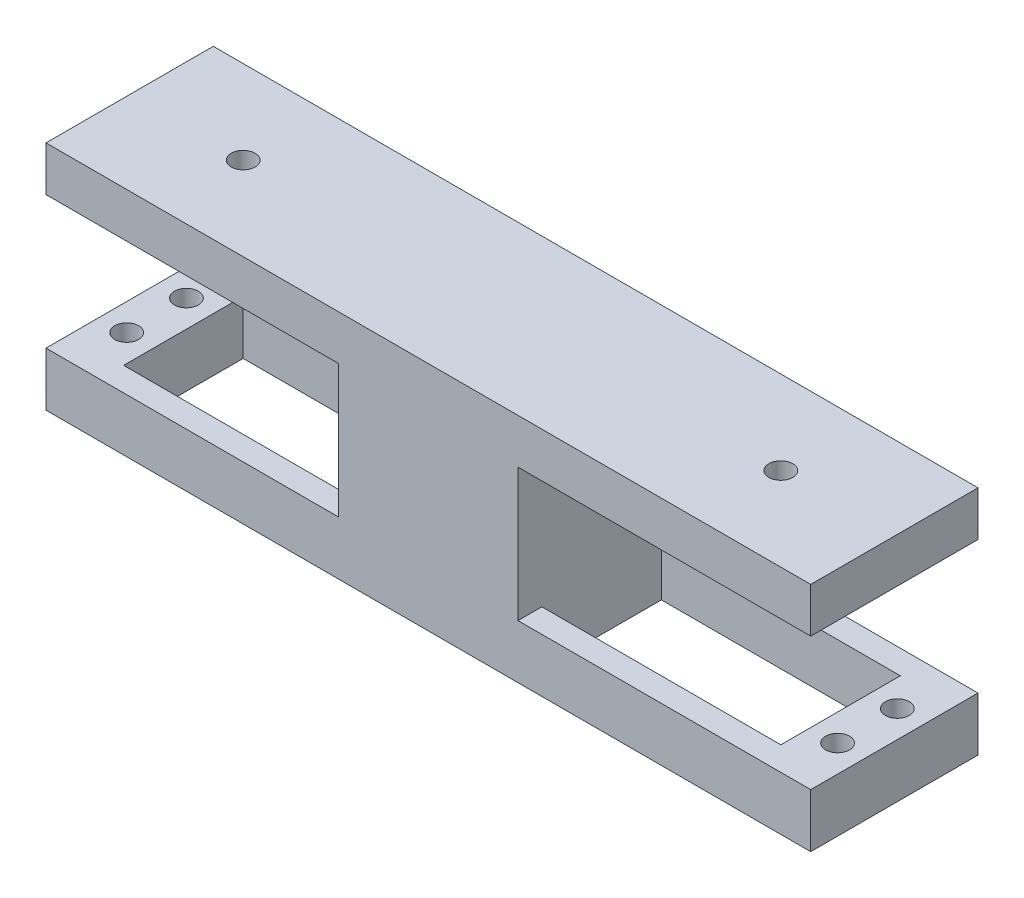
ISO-10303-21;
HEADER;
FILE_DESCRIPTION(('STEP AP214'),'2;1');
FILE_NAME('part.step','',(''),(''),'','','');
FILE_SCHEMA(('AUTOMOTIVE_DESIGN { 1 0 10303 214 1 1 1 1 }'));
ENDSEC;
DATA;
#1=APPLICATION_CONTEXT('core data for automotive mechanical design processes');
#2=APPLICATION_PROTOCOL_DEFINITION('international standard','automotive_design',2000,#1);
#3=PRODUCT_CONTEXT('',#1,'mechanical');
#4=PRODUCT('Part','Part','',(#3));
#5=PRODUCT_RELATED_PRODUCT_CATEGORY('part','',(#4));
#6=PRODUCT_DEFINITION_FORMATION('','',#4);
#7=PRODUCT_DEFINITION_CONTEXT('part definition',#1,'design');
#8=PRODUCT_DEFINITION('design','',#6,#7);
#9=PRODUCT_DEFINITION_SHAPE('','',#8);
#10=(LENGTH_UNIT() NAMED_UNIT(*) SI_UNIT(.MILLI.,.METRE.));
#11=(NAMED_UNIT(*) PLANE_ANGLE_UNIT() SI_UNIT($,.RADIAN.));
#12=(NAMED_UNIT(*) SI_UNIT($,.STERADIAN.) SOLID_ANGLE_UNIT());
#13=UNCERTAINTY_MEASURE_WITH_UNIT(LENGTH_MEASURE(1.E-05),#10,'distance_accuracy_value','');
#14=(GEOMETRIC_REPRESENTATION_CONTEXT(3) GLOBAL_UNCERTAINTY_ASSIGNED_CONTEXT((#13)) GLOBAL_UNIT_ASSIGNED_CONTEXT((#10,
#11,#12)) REPRESENTATION_CONTEXT('',''));
#15=CARTESIAN_POINT('',(0.,0.,0.));
#16=DIRECTION('',(0.,0.,1.));
#17=DIRECTION('',(1.,0.,0.));
#18=AXIS2_PLACEMENT_3D('',#15,#16,#17);
#19=CARTESIAN_POINT('',(0.,0.,28.));
#20=DIRECTION('',(0.,1.,0.));
#21=DIRECTION('',(0.,0.,1.));
#22=AXIS2_PLACEMENT_3D('',#19,#20,#21);
#23=PLANE('',#22);
#24=CARTESIAN_POINT('',(139.5,0.,19.));
#25=DIRECTION('',(0.,-1.,0.));
#26=DIRECTION('',(0.,0.,-1.));
#27=AXIS2_PLACEMENT_3D('',#24,#25,#26);
#28=CIRCLE('',#27,2.00000000000328);
#29=CARTESIAN_POINT('',(139.5,0.,16.9999999999967));
#30=VERTEX_POINT('',#29);
#31=EDGE_CURVE('E276',#30,#30,#28,.T.);
#32=ORIENTED_EDGE('',*,*,#31,.F.);
#33=EDGE_LOOP('',(#32));
#34=FACE_BOUND('',#33,.T.);
#35=CARTESIAN_POINT('',(90.5,0.,9.));
#36=DIRECTION('',(0.,-1.,0.));
#37=DIRECTION('',(0.,0.,-1.));
#38=AXIS2_PLACEMENT_3D('',#35,#36,#37);
#39=CIRCLE('',#38,2.);
#40=CARTESIAN_POINT('',(90.5,0.,7.));
#41=VERTEX_POINT('',#40);
#42=EDGE_CURVE('E284',#41,#41,#39,.T.);
#43=ORIENTED_EDGE('',*,*,#42,.F.);
#44=EDGE_LOOP('',(#43));
#45=FACE_BOUND('',#44,.T.);
#46=CARTESIAN_POINT('',(90.5,0.,19.));
#47=DIRECTION('',(0.,-1.,0.));
#48=DIRECTION('',(0.,0.,-1.));
#49=AXIS2_PLACEMENT_3D('',#46,#47,#48);
#50=CIRCLE('',#49,2.0000000000021);
#51=CARTESIAN_POINT('',(90.5,0.,16.9999999999979));
#52=VERTEX_POINT('',#51);
#53=EDGE_CURVE('E301',#52,#52,#50,.T.);
#54=ORIENTED_EDGE('',*,*,#53,.F.);
#55=EDGE_LOOP('',(#54));
#56=FACE_BOUND('',#55,.T.);
#57=CARTESIAN_POINT('',(20.5,0.,19.));
#58=DIRECTION('',(0.,-1.,0.));
#59=DIRECTION('',(0.,0.,-1.));
#60=AXIS2_PLACEMENT_3D('',#57,#58,#59);
#61=CIRCLE('',#60,2.00000000000001);
#62=CARTESIAN_POINT('',(20.5,0.,17.));
#63=VERTEX_POINT('',#62);
#64=EDGE_CURVE('E296',#63,#63,#61,.T.);
#65=ORIENTED_EDGE('',*,*,#64,.F.);
#66=EDGE_LOOP('',(#65));
#67=FACE_BOUND('',#66,.T.);
#68=CARTESIAN_POINT('',(69.5,0.,9.));
#69=DIRECTION('',(0.,-1.,0.));
#70=DIRECTION('',(0.,0.,-1.));
#71=AXIS2_PLACEMENT_3D('',#68,#69,#70);
#72=CIRCLE('',#71,2.0000000000021);
#73=CARTESIAN_POINT('',(69.5,0.,6.9999999999979));
#74=VERTEX_POINT('',#73);
#75=EDGE_CURVE('E264',#74,#74,#72,.T.);
#76=ORIENTED_EDGE('',*,*,#75,.F.);
#77=EDGE_LOOP('',(#76));
#78=FACE_BOUND('',#77,.T.);
#79=CARTESIAN_POINT('',(69.5,0.,19.));
#80=DIRECTION('',(0.,-1.,0.));
#81=DIRECTION('',(0.,0.,-1.));
#82=AXIS2_PLACEMENT_3D('',#79,#80,#81);
#83=CIRCLE('',#82,2.);
#84=CARTESIAN_POINT('',(69.5,0.,17.));
#85=VERTEX_POINT('',#84);
#86=EDGE_CURVE('E277',#85,#85,#83,.T.);
#87=ORIENTED_EDGE('',*,*,#86,.F.);
#88=EDGE_LOOP('',(#87));
#89=FACE_BOUND('',#88,.T.);
#90=CARTESIAN_POINT('',(139.5,0.,8.99999999999999));
#91=DIRECTION('',(0.,-1.,0.));
#92=DIRECTION('',(0.,0.,-1.));
#93=AXIS2_PLACEMENT_3D('',#90,#91,#92);
#94=CIRCLE('',#93,2.);
#95=CARTESIAN_POINT('',(139.5,0.,6.99999999999999));
#96=VERTEX_POINT('',#95);
#97=EDGE_CURVE('E272',#96,#96,#94,.T.);
#98=ORIENTED_EDGE('',*,*,#97,.F.);
#99=EDGE_LOOP('',(#98));
#100=FACE_BOUND('',#99,.T.);
#101=CARTESIAN_POINT('',(20.5,0.,9.));
#102=DIRECTION('',(0.,-1.,0.));
#103=DIRECTION('',(0.,0.,-1.));
#104=AXIS2_PLACEMENT_3D('',#101,#102,#103);
#105=CIRCLE('',#104,2.0000000000033);
#106=CARTESIAN_POINT('',(20.5,0.,6.9999999999967));
#107=VERTEX_POINT('',#106);
#108=EDGE_CURVE('E300',#107,#107,#105,.T.);
#109=ORIENTED_EDGE('',*,*,#108,.F.);
#110=EDGE_LOOP('',(#109));
#111=FACE_BOUND('',#110,.T.);
#112=DIRECTION('',(0.,0.,1.));
#113=VECTOR('',#112,1.);
#114=CARTESIAN_POINT('',(65.,0.,14.));
#115=LINE('',#114,#113);
#116=CARTESIAN_POINT('',(65.,0.,4.));
#117=VERTEX_POINT('',#116);
#118=CARTESIAN_POINT('',(65.,0.,24.));
#119=VERTEX_POINT('',#118);
#120=EDGE_CURVE('E312',#117,#119,#115,.T.);
#121=ORIENTED_EDGE('',*,*,#120,.F.);
#122=DIRECTION('',(1.,0.,0.));
#123=VECTOR('',#122,1.);
#124=CARTESIAN_POINT('',(25.,0.,4.));
#125=LINE('',#124,#123);
#126=CARTESIAN_POINT('',(25.,0.,4.));
#127=VERTEX_POINT('',#126);
#128=EDGE_CURVE('E325',#127,#117,#125,.T.);
#129=ORIENTED_EDGE('',*,*,#128,.F.);
#130=DIRECTION('',(0.,0.,-1.));
#131=VECTOR('',#130,1.);
#132=CARTESIAN_POINT('',(25.,0.,24.));
#133=LINE('',#132,#131);
#134=CARTESIAN_POINT('',(25.,0.,24.));
#135=VERTEX_POINT('',#134);
#136=EDGE_CURVE('E321',#135,#127,#133,.T.);
#137=ORIENTED_EDGE('',*,*,#136,.F.);
#138=DIRECTION('',(-1.,0.,0.));
#139=VECTOR('',#138,1.);
#140=CARTESIAN_POINT('',(65.,0.,24.));
#141=LINE('',#140,#139);
#142=EDGE_CURVE('E316',#119,#135,#141,.T.);
#143=ORIENTED_EDGE('',*,*,#142,.F.);
#144=EDGE_LOOP('',(#121,#129,#137,#143));
#145=FACE_BOUND('',#144,.T.);
#146=DIRECTION('',(0.,0.,1.));
#147=VECTOR('',#146,1.);
#148=CARTESIAN_POINT('',(135.,0.,24.));
#149=LINE('',#148,#147);
#150=CARTESIAN_POINT('',(135.,0.,4.));
#151=VERTEX_POINT('',#150);
#152=CARTESIAN_POINT('',(135.,0.,24.));
#153=VERTEX_POINT('',#152);
#154=EDGE_CURVE('E364',#151,#153,#149,.T.);
#155=ORIENTED_EDGE('',*,*,#154,.F.);
#156=DIRECTION('',(1.,0.,0.));
#157=VECTOR('',#156,1.);
#158=CARTESIAN_POINT('',(135.,0.,4.));
#159=LINE('',#158,#157);
#160=CARTESIAN_POINT('',(95.,0.,4.));
#161=VERTEX_POINT('',#160);
#162=EDGE_CURVE('E317',#161,#151,#159,.T.);
#163=ORIENTED_EDGE('',*,*,#162,.F.);
#164=DIRECTION('',(0.,0.,-1.));
#165=VECTOR('',#164,1.);
#166=CARTESIAN_POINT('',(95.,0.,4.));
#167=LINE('',#166,#165);
#168=CARTESIAN_POINT('',(95.,0.,24.));
#169=VERTEX_POINT('',#168);
#170=EDGE_CURVE('E346',#169,#161,#167,.T.);
#171=ORIENTED_EDGE('',*,*,#170,.F.);
#172=DIRECTION('',(-1.,0.,0.));
#173=VECTOR('',#172,1.);
#174=CARTESIAN_POINT('',(95.,0.,24.));
#175=LINE('',#174,#173);
#176=EDGE_CURVE('E360',#153,#169,#175,.T.);
#177=ORIENTED_EDGE('',*,*,#176,.F.);
#178=EDGE_LOOP('',(#155,#163,#171,#177));
#179=FACE_BOUND('',#178,.T.);
#180=DIRECTION('',(1.,0.,0.));
#181=VECTOR('',#180,1.);
#182=CARTESIAN_POINT('',(0.,0.,0.));
#183=LINE('',#182,#181);
#184=CARTESIAN_POINT('',(16.,0.,0.));
#185=VERTEX_POINT('',#184);
#186=CARTESIAN_POINT('',(144.,0.,0.));
#187=VERTEX_POINT('',#186);
#188=EDGE_CURVE('E396',#185,#187,#183,.T.);
#189=ORIENTED_EDGE('',*,*,#188,.T.);
#190=DIRECTION('',(0.,0.,1.));
#191=VECTOR('',#190,1.);
#192=CARTESIAN_POINT('',(144.,0.,28.));
#193=LINE('',#192,#191);
#194=CARTESIAN_POINT('',(144.,0.,28.));
#195=VERTEX_POINT('',#194);
#196=EDGE_CURVE('E259',#187,#195,#193,.T.);
#197=ORIENTED_EDGE('',*,*,#196,.T.);
#198=DIRECTION('',(1.,0.,0.));
#199=VECTOR('',#198,1.);
#200=CARTESIAN_POINT('',(0.,0.,28.));
#201=LINE('',#200,#199);
#202=CARTESIAN_POINT('',(16.,0.,28.));
#203=VERTEX_POINT('',#202);
#204=EDGE_CURVE('E413',#203,#195,#201,.T.);
#205=ORIENTED_EDGE('',*,*,#204,.F.);
#206=DIRECTION('',(0.,0.,-1.));
#207=VECTOR('',#206,1.);
#208=CARTESIAN_POINT('',(16.,0.,28.));
#209=LINE('',#208,#207);
#210=EDGE_CURVE('E244',#203,#185,#209,.T.);
#211=ORIENTED_EDGE('',*,*,#210,.T.);
#212=EDGE_LOOP('',(#189,#197,#205,#211));
#213=FACE_BOUND('',#212,.T.);
#214=ADVANCED_FACE('F45',(#34,#45,#56,#67,#78,#89,#100,#111,#145,#179,#213),#23,.F.);
#215=CARTESIAN_POINT('',(0.,0.,28.));
#216=DIRECTION('',(0.,0.,1.));
#217=DIRECTION('',(1.,0.,0.));
#218=AXIS2_PLACEMENT_3D('',#215,#216,#217);
#219=PLANE('',#218);
#220=DIRECTION('',(0.,-1.,0.));
#221=VECTOR('',#220,1.);
#222=CARTESIAN_POINT('',(95.,34.,28.));
#223=LINE('',#222,#221);
#224=CARTESIAN_POINT('',(95.,31.25,28.));
#225=VERTEX_POINT('',#224);
#226=CARTESIAN_POINT('',(95.,9.00000000000001,28.));
#227=VERTEX_POINT('',#226);
#228=EDGE_CURVE('E401',#225,#227,#223,.T.);
#229=ORIENTED_EDGE('',*,*,#228,.F.);
#230=DIRECTION('',(1.,0.,0.));
#231=VECTOR('',#230,1.);
#232=CARTESIAN_POINT('',(144.,31.25,28.));
#233=LINE('',#232,#231);
#234=CARTESIAN_POINT('',(144.,31.25,28.));
#235=VERTEX_POINT('',#234);
#236=EDGE_CURVE('E232',#225,#235,#233,.T.);
#237=ORIENTED_EDGE('',*,*,#236,.T.);
#238=DIRECTION('',(0.,-1.,0.));
#239=VECTOR('',#238,1.);
#240=CARTESIAN_POINT('',(144.,45.,28.));
#241=LINE('',#240,#239);
#242=CARTESIAN_POINT('',(144.,38.75,28.));
#243=VERTEX_POINT('',#242);
#244=EDGE_CURVE('E246',#243,#235,#241,.T.);
#245=ORIENTED_EDGE('',*,*,#244,.F.);
#246=DIRECTION('',(1.,0.,0.));
#247=VECTOR('',#246,1.);
#248=CARTESIAN_POINT('',(16.,38.75,28.));
#249=LINE('',#248,#247);
#250=CARTESIAN_POINT('',(16.,38.75,28.));
#251=VERTEX_POINT('',#250);
#252=EDGE_CURVE('E204',#251,#243,#249,.T.);
#253=ORIENTED_EDGE('',*,*,#252,.F.);
#254=DIRECTION('',(0.,-1.,0.));
#255=VECTOR('',#254,1.);
#256=CARTESIAN_POINT('',(16.,45.,28.));
#257=LINE('',#256,#255);
#258=CARTESIAN_POINT('',(16.,31.25,28.));
#259=VERTEX_POINT('',#258);
#260=EDGE_CURVE('E199',#251,#259,#257,.T.);
#261=ORIENTED_EDGE('',*,*,#260,.T.);
#262=CARTESIAN_POINT('',(65.,31.25,28.));
#263=VERTEX_POINT('',#262);
#264=EDGE_CURVE('E228',#259,#263,#233,.T.);
#265=ORIENTED_EDGE('',*,*,#264,.T.);
#266=DIRECTION('',(0.,1.,0.));
#267=VECTOR('',#266,1.);
#268=CARTESIAN_POINT('',(65.,34.,28.));
#269=LINE('',#268,#267);
#270=CARTESIAN_POINT('',(65.,9.00000000000001,28.));
#271=VERTEX_POINT('',#270);
#272=EDGE_CURVE('E382',#271,#263,#269,.T.);
#273=ORIENTED_EDGE('',*,*,#272,.F.);
#274=DIRECTION('',(1.,0.,0.));
#275=VECTOR('',#274,1.);
#276=CARTESIAN_POINT('',(65.,9.00000000000001,28.));
#277=LINE('',#276,#275);
#278=CARTESIAN_POINT('',(16.,9.,28.));
#279=VERTEX_POINT('',#278);
#280=EDGE_CURVE('E386',#279,#271,#277,.T.);
#281=ORIENTED_EDGE('',*,*,#280,.F.);
#282=EDGE_CURVE('E193',#279,#203,#257,.T.);
#283=ORIENTED_EDGE('',*,*,#282,.T.);
#284=ORIENTED_EDGE('',*,*,#204,.T.);
#285=CARTESIAN_POINT('',(144.,9.00000000000001,28.));
#286=VERTEX_POINT('',#285);
#287=EDGE_CURVE('E249',#286,#195,#241,.T.);
#288=ORIENTED_EDGE('',*,*,#287,.F.);
#289=DIRECTION('',(1.,0.,0.));
#290=VECTOR('',#289,1.);
#291=CARTESIAN_POINT('',(95.,9.00000000000001,28.));
#292=LINE('',#291,#290);
#293=EDGE_CURVE('E389',#227,#286,#292,.T.);
#294=ORIENTED_EDGE('',*,*,#293,.F.);
#295=EDGE_LOOP('',(#229,#237,#245,#253,#261,#265,#273,#281,#283,#284,#288,#294));
#296=FACE_BOUND('',#295,.T.);
#297=ADVANCED_FACE('F464',(#296),#219,.T.);
#298=CARTESIAN_POINT('',(0.,0.,0.));
#299=DIRECTION('',(0.,0.,1.));
#300=DIRECTION('',(1.,0.,0.));
#301=AXIS2_PLACEMENT_3D('',#298,#299,#300);
#302=PLANE('',#301);
#303=DIRECTION('',(0.,1.,0.));
#304=VECTOR('',#303,1.);
#305=CARTESIAN_POINT('',(65.,34.,0.));
#306=LINE('',#305,#304);
#307=CARTESIAN_POINT('',(65.,9.00000000000001,0.));
#308=VERTEX_POINT('',#307);
#309=CARTESIAN_POINT('',(65.,31.25,0.));
#310=VERTEX_POINT('',#309);
#311=EDGE_CURVE('E381',#308,#310,#306,.T.);
#312=ORIENTED_EDGE('',*,*,#311,.T.);
#313=DIRECTION('',(1.,0.,0.));
#314=VECTOR('',#313,1.);
#315=CARTESIAN_POINT('',(144.,31.25,0.));
#316=LINE('',#315,#314);
#317=CARTESIAN_POINT('',(16.,31.25,0.));
#318=VERTEX_POINT('',#317);
#319=EDGE_CURVE('E188',#318,#310,#316,.T.);
#320=ORIENTED_EDGE('',*,*,#319,.F.);
#321=DIRECTION('',(0.,-1.,0.));
#322=VECTOR('',#321,1.);
#323=CARTESIAN_POINT('',(16.,45.,0.));
#324=LINE('',#323,#322);
#325=CARTESIAN_POINT('',(16.,38.75,0.));
#326=VERTEX_POINT('',#325);
#327=EDGE_CURVE('E181',#326,#318,#324,.T.);
#328=ORIENTED_EDGE('',*,*,#327,.F.);
#329=DIRECTION('',(-1.,0.,0.));
#330=VECTOR('',#329,1.);
#331=CARTESIAN_POINT('',(144.,38.75,0.));
#332=LINE('',#331,#330);
#333=CARTESIAN_POINT('',(144.,38.75,0.));
#334=VERTEX_POINT('',#333);
#335=EDGE_CURVE('E186',#334,#326,#332,.T.);
#336=ORIENTED_EDGE('',*,*,#335,.F.);
#337=DIRECTION('',(0.,-1.,0.));
#338=VECTOR('',#337,1.);
#339=CARTESIAN_POINT('',(144.,45.,0.));
#340=LINE('',#339,#338);
#341=CARTESIAN_POINT('',(144.,31.25,0.));
#342=VERTEX_POINT('',#341);
#343=EDGE_CURVE('E241',#334,#342,#340,.T.);
#344=ORIENTED_EDGE('',*,*,#343,.T.);
#345=CARTESIAN_POINT('',(95.,31.25,0.));
#346=VERTEX_POINT('',#345);
#347=EDGE_CURVE('E227',#346,#342,#316,.T.);
#348=ORIENTED_EDGE('',*,*,#347,.F.);
#349=DIRECTION('',(0.,-1.,0.));
#350=VECTOR('',#349,1.);
#351=CARTESIAN_POINT('',(95.,34.,0.));
#352=LINE('',#351,#350);
#353=CARTESIAN_POINT('',(95.,9.00000000000001,0.));
#354=VERTEX_POINT('',#353);
#355=EDGE_CURVE('E67',#346,#354,#352,.T.);
#356=ORIENTED_EDGE('',*,*,#355,.T.);
#357=DIRECTION('',(1.,0.,0.));
#358=VECTOR('',#357,1.);
#359=CARTESIAN_POINT('',(95.,9.00000000000001,0.));
#360=LINE('',#359,#358);
#361=CARTESIAN_POINT('',(144.,9.,0.));
#362=VERTEX_POINT('',#361);
#363=EDGE_CURVE('E404',#354,#362,#360,.T.);
#364=ORIENTED_EDGE('',*,*,#363,.T.);
#365=EDGE_CURVE('E245',#362,#187,#340,.T.);
#366=ORIENTED_EDGE('',*,*,#365,.T.);
#367=ORIENTED_EDGE('',*,*,#188,.F.);
#368=CARTESIAN_POINT('',(16.,9.00000000000001,0.));
#369=VERTEX_POINT('',#368);
#370=EDGE_CURVE('E194',#369,#185,#324,.T.);
#371=ORIENTED_EDGE('',*,*,#370,.F.);
#372=DIRECTION('',(1.,0.,0.));
#373=VECTOR('',#372,1.);
#374=CARTESIAN_POINT('',(65.,9.00000000000001,0.));
#375=LINE('',#374,#373);
#376=EDGE_CURVE('E378',#369,#308,#375,.T.);
#377=ORIENTED_EDGE('',*,*,#376,.T.);
#378=EDGE_LOOP('',(#312,#320,#328,#336,#344,#348,#356,#364,#366,#367,#371,#377));
#379=FACE_BOUND('',#378,.T.);
#380=ADVANCED_FACE('F184',(#379),#302,.F.);
#381=CARTESIAN_POINT('',(95.,9.00000000000001,0.));
#382=DIRECTION('',(0.,-1.,0.));
#383=DIRECTION('',(1.,0.,0.));
#384=AXIS2_PLACEMENT_3D('',#381,#382,#383);
#385=PLANE('',#384);
#386=CARTESIAN_POINT('',(139.5,9.,19.));
#387=DIRECTION('',(0.,-1.,0.));
#388=DIRECTION('',(1.,0.,0.));
#389=AXIS2_PLACEMENT_3D('',#386,#387,#388);
#390=CIRCLE('',#389,2.00000000000328);
#391=CARTESIAN_POINT('',(141.500000000003,9.,19.));
#392=VERTEX_POINT('',#391);
#393=EDGE_CURVE('E356',#392,#392,#390,.T.);
#394=ORIENTED_EDGE('',*,*,#393,.T.);
#395=EDGE_LOOP('',(#394));
#396=FACE_BOUND('',#395,.T.);
#397=CARTESIAN_POINT('',(139.5,9.,8.99999999999999));
#398=DIRECTION('',(0.,-1.,0.));
#399=DIRECTION('',(1.,0.,0.));
#400=AXIS2_PLACEMENT_3D('',#397,#398,#399);
#401=CIRCLE('',#400,2.);
#402=CARTESIAN_POINT('',(141.5,9.,8.99999999999999));
#403=VERTEX_POINT('',#402);
#404=EDGE_CURVE('E443',#403,#403,#401,.T.);
#405=ORIENTED_EDGE('',*,*,#404,.T.);
#406=EDGE_LOOP('',(#405));
#407=FACE_BOUND('',#406,.T.);
#408=ORIENTED_EDGE('',*,*,#293,.T.);
#409=DIRECTION('',(0.,0.,-1.));
#410=VECTOR('',#409,1.);
#411=CARTESIAN_POINT('',(144.,9.,0.));
#412=LINE('',#411,#410);
#413=EDGE_CURVE('E255',#286,#362,#412,.T.);
#414=ORIENTED_EDGE('',*,*,#413,.T.);
#415=ORIENTED_EDGE('',*,*,#363,.F.);
#416=DIRECTION('',(0.,0.,1.));
#417=VECTOR('',#416,1.);
#418=CARTESIAN_POINT('',(95.,9.00000000000001,0.));
#419=LINE('',#418,#417);
#420=CARTESIAN_POINT('',(95.,9.00000000000001,4.));
#421=VERTEX_POINT('',#420);
#422=EDGE_CURVE('E397',#354,#421,#419,.T.);
#423=ORIENTED_EDGE('',*,*,#422,.T.);
#424=DIRECTION('',(1.,0.,0.));
#425=VECTOR('',#424,1.);
#426=CARTESIAN_POINT('',(95.,9.00000000000001,4.));
#427=LINE('',#426,#425);
#428=CARTESIAN_POINT('',(135.,9.,4.));
#429=VERTEX_POINT('',#428);
#430=EDGE_CURVE('E373',#421,#429,#427,.T.);
#431=ORIENTED_EDGE('',*,*,#430,.T.);
#432=DIRECTION('',(0.,0.,1.));
#433=VECTOR('',#432,1.);
#434=CARTESIAN_POINT('',(135.,9.,0.));
#435=LINE('',#434,#433);
#436=CARTESIAN_POINT('',(135.,9.,24.));
#437=VERTEX_POINT('',#436);
#438=EDGE_CURVE('E432',#429,#437,#435,.T.);
#439=ORIENTED_EDGE('',*,*,#438,.T.);
#440=DIRECTION('',(-1.,0.,0.));
#441=VECTOR('',#440,1.);
#442=CARTESIAN_POINT('',(95.,9.00000000000001,24.));
#443=LINE('',#442,#441);
#444=CARTESIAN_POINT('',(95.,9.00000000000001,24.));
#445=VERTEX_POINT('',#444);
#446=EDGE_CURVE('E333',#437,#445,#443,.T.);
#447=ORIENTED_EDGE('',*,*,#446,.T.);
#448=EDGE_CURVE('E377',#445,#227,#419,.T.);
#449=ORIENTED_EDGE('',*,*,#448,.T.);
#450=EDGE_LOOP('',(#408,#414,#415,#423,#431,#439,#447,#449));
#451=FACE_BOUND('',#450,.T.);
#452=ADVANCED_FACE('F661',(#396,#407,#451),#385,.F.);
#453=CARTESIAN_POINT('',(95.,34.,0.));
#454=DIRECTION('',(-1.,0.,0.));
#455=DIRECTION('',(0.,0.,1.));
#456=AXIS2_PLACEMENT_3D('',#453,#454,#455);
#457=PLANE('',#456);
#458=ORIENTED_EDGE('',*,*,#355,.F.);
#459=DIRECTION('',(0.,0.,1.));
#460=VECTOR('',#459,1.);
#461=CARTESIAN_POINT('',(95.,31.25,0.));
#462=LINE('',#461,#460);
#463=EDGE_CURVE('E62',#346,#225,#462,.T.);
#464=ORIENTED_EDGE('',*,*,#463,.T.);
#465=ORIENTED_EDGE('',*,*,#228,.T.);
#466=ORIENTED_EDGE('',*,*,#448,.F.);
#467=DIRECTION('',(0.,-1.,0.));
#468=VECTOR('',#467,1.);
#469=CARTESIAN_POINT('',(95.,28.,24.));
#470=LINE('',#469,#468);
#471=EDGE_CURVE('E350',#445,#169,#470,.T.);
#472=ORIENTED_EDGE('',*,*,#471,.T.);
#473=ORIENTED_EDGE('',*,*,#170,.T.);
#474=DIRECTION('',(0.,-1.,0.));
#475=VECTOR('',#474,1.);
#476=CARTESIAN_POINT('',(95.,28.,4.));
#477=LINE('',#476,#475);
#478=EDGE_CURVE('E353',#421,#161,#477,.T.);
#479=ORIENTED_EDGE('',*,*,#478,.F.);
#480=ORIENTED_EDGE('',*,*,#422,.F.);
#481=EDGE_LOOP('',(#458,#464,#465,#466,#472,#473,#479,#480));
#482=FACE_BOUND('',#481,.T.);
#483=ADVANCED_FACE('F686',(#482),#457,.F.);
#484=CARTESIAN_POINT('',(65.,34.,0.));
#485=DIRECTION('',(1.,0.,0.));
#486=DIRECTION('',(0.,0.,-1.));
#487=AXIS2_PLACEMENT_3D('',#484,#485,#486);
#488=PLANE('',#487);
#489=ORIENTED_EDGE('',*,*,#272,.T.);
#490=DIRECTION('',(0.,0.,-1.));
#491=VECTOR('',#490,1.);
#492=CARTESIAN_POINT('',(65.,31.25,0.));
#493=LINE('',#492,#491);
#494=EDGE_CURVE('E11',#263,#310,#493,.T.);
#495=ORIENTED_EDGE('',*,*,#494,.T.);
#496=ORIENTED_EDGE('',*,*,#311,.F.);
#497=DIRECTION('',(0.,0.,1.));
#498=VECTOR('',#497,1.);
#499=CARTESIAN_POINT('',(65.,9.00000000000001,0.));
#500=LINE('',#499,#498);
#501=CARTESIAN_POINT('',(65.,9.00000000000001,4.));
#502=VERTEX_POINT('',#501);
#503=EDGE_CURVE('E392',#308,#502,#500,.T.);
#504=ORIENTED_EDGE('',*,*,#503,.T.);
#505=DIRECTION('',(0.,-1.,0.));
#506=VECTOR('',#505,1.);
#507=CARTESIAN_POINT('',(65.,28.,4.));
#508=LINE('',#507,#506);
#509=EDGE_CURVE('E329',#502,#117,#508,.T.);
#510=ORIENTED_EDGE('',*,*,#509,.T.);
#511=ORIENTED_EDGE('',*,*,#120,.T.);
#512=DIRECTION('',(0.,-1.,0.));
#513=VECTOR('',#512,1.);
#514=CARTESIAN_POINT('',(65.,28.,24.));
#515=LINE('',#514,#513);
#516=CARTESIAN_POINT('',(65.,9.00000000000001,24.));
#517=VERTEX_POINT('',#516);
#518=EDGE_CURVE('E328',#517,#119,#515,.T.);
#519=ORIENTED_EDGE('',*,*,#518,.F.);
#520=EDGE_CURVE('E385',#517,#271,#500,.T.);
#521=ORIENTED_EDGE('',*,*,#520,.T.);
#522=EDGE_LOOP('',(#489,#495,#496,#504,#510,#511,#519,#521));
#523=FACE_BOUND('',#522,.T.);
#524=ADVANCED_FACE('F487',(#523),#488,.F.);
#525=CARTESIAN_POINT('',(65.,9.00000000000001,0.));
#526=DIRECTION('',(0.,-1.,0.));
#527=DIRECTION('',(1.,0.,0.));
#528=AXIS2_PLACEMENT_3D('',#525,#526,#527);
#529=PLANE('',#528);
#530=CARTESIAN_POINT('',(20.5,9.,19.));
#531=DIRECTION('',(0.,-1.,0.));
#532=DIRECTION('',(1.,0.,0.));
#533=AXIS2_PLACEMENT_3D('',#530,#531,#532);
#534=CIRCLE('',#533,2.00000000000001);
#535=CARTESIAN_POINT('',(22.5,9.,19.));
#536=VERTEX_POINT('',#535);
#537=EDGE_CURVE('E439',#536,#536,#534,.T.);
#538=ORIENTED_EDGE('',*,*,#537,.T.);
#539=EDGE_LOOP('',(#538));
#540=FACE_BOUND('',#539,.T.);
#541=CARTESIAN_POINT('',(20.5,9.,9.));
#542=DIRECTION('',(0.,-1.,0.));
#543=DIRECTION('',(1.,0.,0.));
#544=AXIS2_PLACEMENT_3D('',#541,#542,#543);
#545=CIRCLE('',#544,2.0000000000033);
#546=CARTESIAN_POINT('',(22.5000000000033,9.,9.));
#547=VERTEX_POINT('',#546);
#548=EDGE_CURVE('E311',#547,#547,#545,.T.);
#549=ORIENTED_EDGE('',*,*,#548,.T.);
#550=EDGE_LOOP('',(#549));
#551=FACE_BOUND('',#550,.T.);
#552=ORIENTED_EDGE('',*,*,#376,.F.);
#553=DIRECTION('',(0.,0.,1.));
#554=VECTOR('',#553,1.);
#555=CARTESIAN_POINT('',(16.,9.,0.));
#556=LINE('',#555,#554);
#557=EDGE_CURVE('E54',#369,#279,#556,.T.);
#558=ORIENTED_EDGE('',*,*,#557,.T.);
#559=ORIENTED_EDGE('',*,*,#280,.T.);
#560=ORIENTED_EDGE('',*,*,#520,.F.);
#561=DIRECTION('',(-1.,0.,0.));
#562=VECTOR('',#561,1.);
#563=CARTESIAN_POINT('',(65.,9.00000000000001,24.));
#564=LINE('',#563,#562);
#565=CARTESIAN_POINT('',(25.,9.00000000000001,24.));
#566=VERTEX_POINT('',#565);
#567=EDGE_CURVE('E417',#517,#566,#564,.T.);
#568=ORIENTED_EDGE('',*,*,#567,.T.);
#569=DIRECTION('',(0.,0.,-1.));
#570=VECTOR('',#569,1.);
#571=CARTESIAN_POINT('',(25.,9.,0.));
#572=LINE('',#571,#570);
#573=CARTESIAN_POINT('',(25.,9.,4.));
#574=VERTEX_POINT('',#573);
#575=EDGE_CURVE('E424',#566,#574,#572,.T.);
#576=ORIENTED_EDGE('',*,*,#575,.T.);
#577=DIRECTION('',(1.,0.,0.));
#578=VECTOR('',#577,1.);
#579=CARTESIAN_POINT('',(65.,9.00000000000001,4.));
#580=LINE('',#579,#578);
#581=EDGE_CURVE('E428',#574,#502,#580,.T.);
#582=ORIENTED_EDGE('',*,*,#581,.T.);
#583=ORIENTED_EDGE('',*,*,#503,.F.);
#584=EDGE_LOOP('',(#552,#558,#559,#560,#568,#576,#582,#583));
#585=FACE_BOUND('',#584,.T.);
#586=ADVANCED_FACE('F500',(#540,#551,#585),#529,.F.);
#587=CARTESIAN_POINT('',(25.,28.,4.));
#588=DIRECTION('',(0.,0.,-1.));
#589=DIRECTION('',(-1.,0.,0.));
#590=AXIS2_PLACEMENT_3D('',#587,#588,#589);
#591=PLANE('',#590);
#592=DIRECTION('',(0.,-1.,0.));
#593=VECTOR('',#592,1.);
#594=CARTESIAN_POINT('',(25.,28.,4.));
#595=LINE('',#594,#593);
#596=EDGE_CURVE('E334',#574,#127,#595,.T.);
#597=ORIENTED_EDGE('',*,*,#596,.T.);
#598=ORIENTED_EDGE('',*,*,#128,.T.);
#599=ORIENTED_EDGE('',*,*,#509,.F.);
#600=ORIENTED_EDGE('',*,*,#581,.F.);
#601=EDGE_LOOP('',(#597,#598,#599,#600));
#602=FACE_BOUND('',#601,.T.);
#603=ADVANCED_FACE('F514',(#602),#591,.F.);
#604=CARTESIAN_POINT('',(25.,28.,24.));
#605=DIRECTION('',(-1.,0.,0.));
#606=DIRECTION('',(0.,0.,1.));
#607=AXIS2_PLACEMENT_3D('',#604,#605,#606);
#608=PLANE('',#607);
#609=DIRECTION('',(0.,-1.,0.));
#610=VECTOR('',#609,1.);
#611=CARTESIAN_POINT('',(25.,28.,24.));
#612=LINE('',#611,#610);
#613=EDGE_CURVE('E337',#566,#135,#612,.T.);
#614=ORIENTED_EDGE('',*,*,#613,.T.);
#615=ORIENTED_EDGE('',*,*,#136,.T.);
#616=ORIENTED_EDGE('',*,*,#596,.F.);
#617=ORIENTED_EDGE('',*,*,#575,.F.);
#618=EDGE_LOOP('',(#614,#615,#616,#617));
#619=FACE_BOUND('',#618,.T.);
#620=ADVANCED_FACE('F513',(#619),#608,.F.);
#621=CARTESIAN_POINT('',(65.,28.,24.));
#622=DIRECTION('',(0.,0.,1.));
#623=DIRECTION('',(1.,0.,0.));
#624=AXIS2_PLACEMENT_3D('',#621,#622,#623);
#625=PLANE('',#624);
#626=ORIENTED_EDGE('',*,*,#518,.T.);
#627=ORIENTED_EDGE('',*,*,#142,.T.);
#628=ORIENTED_EDGE('',*,*,#613,.F.);
#629=ORIENTED_EDGE('',*,*,#567,.F.);
#630=EDGE_LOOP('',(#626,#627,#628,#629));
#631=FACE_BOUND('',#630,.T.);
#632=ADVANCED_FACE('F510',(#631),#625,.F.);
#633=CARTESIAN_POINT('',(135.,28.,24.));
#634=DIRECTION('',(1.,0.,0.));
#635=DIRECTION('',(0.,0.,-1.));
#636=AXIS2_PLACEMENT_3D('',#633,#634,#635);
#637=PLANE('',#636);
#638=DIRECTION('',(0.,-1.,0.));
#639=VECTOR('',#638,1.);
#640=CARTESIAN_POINT('',(135.,28.,4.));
#641=LINE('',#640,#639);
#642=EDGE_CURVE('E342',#429,#151,#641,.T.);
#643=ORIENTED_EDGE('',*,*,#642,.T.);
#644=ORIENTED_EDGE('',*,*,#154,.T.);
#645=DIRECTION('',(0.,-1.,0.));
#646=VECTOR('',#645,1.);
#647=CARTESIAN_POINT('',(135.,28.,24.));
#648=LINE('',#647,#646);
#649=EDGE_CURVE('E347',#437,#153,#648,.T.);
#650=ORIENTED_EDGE('',*,*,#649,.F.);
#651=ORIENTED_EDGE('',*,*,#438,.F.);
#652=EDGE_LOOP('',(#643,#644,#650,#651));
#653=FACE_BOUND('',#652,.T.);
#654=ADVANCED_FACE('F757',(#653),#637,.F.);
#655=CARTESIAN_POINT('',(135.,28.,4.));
#656=DIRECTION('',(0.,0.,-1.));
#657=DIRECTION('',(-1.,0.,0.));
#658=AXIS2_PLACEMENT_3D('',#655,#656,#657);
#659=PLANE('',#658);
#660=ORIENTED_EDGE('',*,*,#478,.T.);
#661=ORIENTED_EDGE('',*,*,#162,.T.);
#662=ORIENTED_EDGE('',*,*,#642,.F.);
#663=ORIENTED_EDGE('',*,*,#430,.F.);
#664=EDGE_LOOP('',(#660,#661,#662,#663));
#665=FACE_BOUND('',#664,.T.);
#666=ADVANCED_FACE('F563',(#665),#659,.F.);
#667=CARTESIAN_POINT('',(95.,28.,24.));
#668=DIRECTION('',(0.,0.,1.));
#669=DIRECTION('',(1.,0.,0.));
#670=AXIS2_PLACEMENT_3D('',#667,#668,#669);
#671=PLANE('',#670);
#672=ORIENTED_EDGE('',*,*,#649,.T.);
#673=ORIENTED_EDGE('',*,*,#176,.T.);
#674=ORIENTED_EDGE('',*,*,#471,.F.);
#675=ORIENTED_EDGE('',*,*,#446,.F.);
#676=EDGE_LOOP('',(#672,#673,#674,#675));
#677=FACE_BOUND('',#676,.T.);
#678=ADVANCED_FACE('F553',(#677),#671,.F.);
#679=CARTESIAN_POINT('',(20.5,10.,9.));
#680=DIRECTION('',(0.,-1.,0.));
#681=DIRECTION('',(0.,0.,-1.));
#682=AXIS2_PLACEMENT_3D('',#679,#680,#681);
#683=CYLINDRICAL_SURFACE('',#682,2.0000000000033);
#684=ORIENTED_EDGE('',*,*,#108,.T.);
#685=EDGE_LOOP('',(#684));
#686=FACE_BOUND('',#685,.T.);
#687=ORIENTED_EDGE('',*,*,#548,.F.);
#688=EDGE_LOOP('',(#687));
#689=FACE_BOUND('',#688,.T.);
#690=ADVANCED_FACE('F549',(#686,#689),#683,.F.);
#691=CARTESIAN_POINT('',(20.5,10.,19.));
#692=DIRECTION('',(0.,-1.,0.));
#693=DIRECTION('',(0.,0.,-1.));
#694=AXIS2_PLACEMENT_3D('',#691,#692,#693);
#695=CYLINDRICAL_SURFACE('',#694,2.00000000000001);
#696=ORIENTED_EDGE('',*,*,#64,.T.);
#697=EDGE_LOOP('',(#696));
#698=FACE_BOUND('',#697,.T.);
#699=ORIENTED_EDGE('',*,*,#537,.F.);
#700=EDGE_LOOP('',(#699));
#701=FACE_BOUND('',#700,.T.);
#702=ADVANCED_FACE('F552',(#698,#701),#695,.F.);
#703=CARTESIAN_POINT('',(139.5,10.,8.99999999999999));
#704=DIRECTION('',(0.,-1.,0.));
#705=DIRECTION('',(0.,0.,-1.));
#706=AXIS2_PLACEMENT_3D('',#703,#704,#705);
#707=CYLINDRICAL_SURFACE('',#706,2.);
#708=ORIENTED_EDGE('',*,*,#97,.T.);
#709=EDGE_LOOP('',(#708));
#710=FACE_BOUND('',#709,.T.);
#711=ORIENTED_EDGE('',*,*,#404,.F.);
#712=EDGE_LOOP('',(#711));
#713=FACE_BOUND('',#712,.T.);
#714=ADVANCED_FACE('F560',(#710,#713),#707,.F.);
#715=CARTESIAN_POINT('',(139.5,10.,19.));
#716=DIRECTION('',(0.,-1.,0.));
#717=DIRECTION('',(0.,0.,-1.));
#718=AXIS2_PLACEMENT_3D('',#715,#716,#717);
#719=CYLINDRICAL_SURFACE('',#718,2.00000000000328);
#720=ORIENTED_EDGE('',*,*,#31,.T.);
#721=EDGE_LOOP('',(#720));
#722=FACE_BOUND('',#721,.T.);
#723=ORIENTED_EDGE('',*,*,#393,.F.);
#724=EDGE_LOOP('',(#723));
#725=FACE_BOUND('',#724,.T.);
#726=ADVANCED_FACE('F577',(#722,#725),#719,.F.);
#727=CARTESIAN_POINT('',(69.5,10.,19.));
#728=DIRECTION('',(0.,-1.,0.));
#729=DIRECTION('',(0.,0.,-1.));
#730=AXIS2_PLACEMENT_3D('',#727,#728,#729);
#731=CYLINDRICAL_SURFACE('',#730,2.);
#732=CARTESIAN_POINT('',(69.5,10.,19.));
#733=DIRECTION('',(0.,-1.,0.));
#734=DIRECTION('',(0.,0.,-1.));
#735=AXIS2_PLACEMENT_3D('',#732,#733,#734);
#736=CIRCLE('',#735,2.);
#737=CARTESIAN_POINT('',(69.5,10.,17.));
#738=VERTEX_POINT('',#737);
#739=EDGE_CURVE('E268',#738,#738,#736,.T.);
#740=ORIENTED_EDGE('',*,*,#739,.F.);
#741=EDGE_LOOP('',(#740));
#742=FACE_BOUND('',#741,.T.);
#743=ORIENTED_EDGE('',*,*,#86,.T.);
#744=EDGE_LOOP('',(#743));
#745=FACE_BOUND('',#744,.T.);
#746=ADVANCED_FACE('F580',(#742,#745),#731,.F.);
#747=CARTESIAN_POINT('',(69.5,10.,19.));
#748=DIRECTION('',(0.,-1.,0.));
#749=DIRECTION('',(0.,0.,-1.));
#750=AXIS2_PLACEMENT_3D('',#747,#748,#749);
#751=PLANE('',#750);
#752=ORIENTED_EDGE('',*,*,#739,.T.);
#753=EDGE_LOOP('',(#752));
#754=FACE_BOUND('',#753,.T.);
#755=ADVANCED_FACE('F589',(#754),#751,.T.);
#756=CARTESIAN_POINT('',(69.5,10.,9.));
#757=DIRECTION('',(0.,-1.,0.));
#758=DIRECTION('',(0.,0.,-1.));
#759=AXIS2_PLACEMENT_3D('',#756,#757,#758);
#760=CYLINDRICAL_SURFACE('',#759,2.0000000000021);
#761=CARTESIAN_POINT('',(69.5,10.,9.));
#762=DIRECTION('',(0.,-1.,0.));
#763=DIRECTION('',(0.,0.,-1.));
#764=AXIS2_PLACEMENT_3D('',#761,#762,#763);
#765=CIRCLE('',#764,2.0000000000021);
#766=CARTESIAN_POINT('',(69.5,10.,6.9999999999979));
#767=VERTEX_POINT('',#766);
#768=EDGE_CURVE('E263',#767,#767,#765,.T.);
#769=ORIENTED_EDGE('',*,*,#768,.F.);
#770=EDGE_LOOP('',(#769));
#771=FACE_BOUND('',#770,.T.);
#772=ORIENTED_EDGE('',*,*,#75,.T.);
#773=EDGE_LOOP('',(#772));
#774=FACE_BOUND('',#773,.T.);
#775=ADVANCED_FACE('F592',(#771,#774),#760,.F.);
#776=CARTESIAN_POINT('',(69.5,10.,9.));
#777=DIRECTION('',(0.,-1.,0.));
#778=DIRECTION('',(0.,0.,-1.));
#779=AXIS2_PLACEMENT_3D('',#776,#777,#778);
#780=PLANE('',#779);
#781=ORIENTED_EDGE('',*,*,#768,.T.);
#782=EDGE_LOOP('',(#781));
#783=FACE_BOUND('',#782,.T.);
#784=ADVANCED_FACE('F574',(#783),#780,.T.);
#785=CARTESIAN_POINT('',(90.5,10.,19.));
#786=DIRECTION('',(0.,-1.,0.));
#787=DIRECTION('',(0.,0.,-1.));
#788=AXIS2_PLACEMENT_3D('',#785,#786,#787);
#789=CYLINDRICAL_SURFACE('',#788,2.0000000000021);
#790=CARTESIAN_POINT('',(90.5,10.,19.));
#791=DIRECTION('',(0.,-1.,0.));
#792=DIRECTION('',(0.,0.,-1.));
#793=AXIS2_PLACEMENT_3D('',#790,#791,#792);
#794=CIRCLE('',#793,2.0000000000021);
#795=CARTESIAN_POINT('',(90.5,10.,16.9999999999979));
#796=VERTEX_POINT('',#795);
#797=EDGE_CURVE('E288',#796,#796,#794,.T.);
#798=ORIENTED_EDGE('',*,*,#797,.F.);
#799=EDGE_LOOP('',(#798));
#800=FACE_BOUND('',#799,.T.);
#801=ORIENTED_EDGE('',*,*,#53,.T.);
#802=EDGE_LOOP('',(#801));
#803=FACE_BOUND('',#802,.T.);
#804=ADVANCED_FACE('F571',(#800,#803),#789,.F.);
#805=CARTESIAN_POINT('',(90.5,10.,19.));
#806=DIRECTION('',(0.,-1.,0.));
#807=DIRECTION('',(0.,0.,-1.));
#808=AXIS2_PLACEMENT_3D('',#805,#806,#807);
#809=PLANE('',#808);
#810=ORIENTED_EDGE('',*,*,#797,.T.);
#811=EDGE_LOOP('',(#810));
#812=FACE_BOUND('',#811,.T.);
#813=ADVANCED_FACE('F567',(#812),#809,.T.);
#814=CARTESIAN_POINT('',(90.5,10.,9.));
#815=DIRECTION('',(0.,-1.,0.));
#816=DIRECTION('',(0.,0.,-1.));
#817=AXIS2_PLACEMENT_3D('',#814,#815,#816);
#818=CYLINDRICAL_SURFACE('',#817,2.);
#819=CARTESIAN_POINT('',(90.5,10.,9.));
#820=DIRECTION('',(0.,-1.,0.));
#821=DIRECTION('',(0.,0.,-1.));
#822=AXIS2_PLACEMENT_3D('',#819,#820,#821);
#823=CIRCLE('',#822,2.);
#824=CARTESIAN_POINT('',(90.5,10.,7.));
#825=VERTEX_POINT('',#824);
#826=EDGE_CURVE('E289',#825,#825,#823,.T.);
#827=ORIENTED_EDGE('',*,*,#826,.F.);
#828=EDGE_LOOP('',(#827));
#829=FACE_BOUND('',#828,.T.);
#830=ORIENTED_EDGE('',*,*,#42,.T.);
#831=EDGE_LOOP('',(#830));
#832=FACE_BOUND('',#831,.T.);
#833=ADVANCED_FACE('F570',(#829,#832),#818,.F.);
#834=CARTESIAN_POINT('',(90.5,10.,9.));
#835=DIRECTION('',(0.,-1.,0.));
#836=DIRECTION('',(0.,0.,-1.));
#837=AXIS2_PLACEMENT_3D('',#834,#835,#836);
#838=PLANE('',#837);
#839=ORIENTED_EDGE('',*,*,#826,.T.);
#840=EDGE_LOOP('',(#839));
#841=FACE_BOUND('',#840,.T.);
#842=ADVANCED_FACE('F582',(#841),#838,.T.);
#843=CARTESIAN_POINT('',(16.,45.,28.));
#844=DIRECTION('',(1.,0.,0.));
#845=DIRECTION('',(0.,0.,-1.));
#846=AXIS2_PLACEMENT_3D('',#843,#844,#845);
#847=PLANE('',#846);
#848=ORIENTED_EDGE('',*,*,#282,.F.);
#849=ORIENTED_EDGE('',*,*,#557,.F.);
#850=ORIENTED_EDGE('',*,*,#370,.T.);
#851=ORIENTED_EDGE('',*,*,#210,.F.);
#852=EDGE_LOOP('',(#848,#849,#850,#851));
#853=FACE_BOUND('',#852,.T.);
#854=ADVANCED_FACE('F584',(#853),#847,.F.);
#855=ORIENTED_EDGE('',*,*,#260,.F.);
#856=DIRECTION('',(0.,0.,1.));
#857=VECTOR('',#856,1.);
#858=CARTESIAN_POINT('',(16.,38.75,0.));
#859=LINE('',#858,#857);
#860=EDGE_CURVE('E197',#326,#251,#859,.T.);
#861=ORIENTED_EDGE('',*,*,#860,.F.);
#862=ORIENTED_EDGE('',*,*,#327,.T.);
#863=DIRECTION('',(0.,0.,1.));
#864=VECTOR('',#863,1.);
#865=CARTESIAN_POINT('',(16.,31.25,0.));
#866=LINE('',#865,#864);
#867=EDGE_CURVE('E226',#318,#259,#866,.T.);
#868=ORIENTED_EDGE('',*,*,#867,.T.);
#869=EDGE_LOOP('',(#855,#861,#862,#868));
#870=FACE_BOUND('',#869,.T.);
#871=ADVANCED_FACE('F198',(#870),#847,.F.);
#872=CARTESIAN_POINT('',(144.,45.,28.));
#873=DIRECTION('',(-1.,0.,0.));
#874=DIRECTION('',(0.,0.,1.));
#875=AXIS2_PLACEMENT_3D('',#872,#873,#874);
#876=PLANE('',#875);
#877=ORIENTED_EDGE('',*,*,#343,.F.);
#878=DIRECTION('',(0.,0.,-1.));
#879=VECTOR('',#878,1.);
#880=CARTESIAN_POINT('',(144.,38.75,28.));
#881=LINE('',#880,#879);
#882=EDGE_CURVE('E209',#243,#334,#881,.T.);
#883=ORIENTED_EDGE('',*,*,#882,.F.);
#884=ORIENTED_EDGE('',*,*,#244,.T.);
#885=DIRECTION('',(0.,0.,1.));
#886=VECTOR('',#885,1.);
#887=CARTESIAN_POINT('',(144.,31.25,0.));
#888=LINE('',#887,#886);
#889=EDGE_CURVE('E233',#342,#235,#888,.T.);
#890=ORIENTED_EDGE('',*,*,#889,.F.);
#891=EDGE_LOOP('',(#877,#883,#884,#890));
#892=FACE_BOUND('',#891,.T.);
#893=ADVANCED_FACE('F472',(#892),#876,.F.);
#894=ORIENTED_EDGE('',*,*,#365,.F.);
#895=ORIENTED_EDGE('',*,*,#413,.F.);
#896=ORIENTED_EDGE('',*,*,#287,.T.);
#897=ORIENTED_EDGE('',*,*,#196,.F.);
#898=EDGE_LOOP('',(#894,#895,#896,#897));
#899=FACE_BOUND('',#898,.T.);
#900=ADVANCED_FACE('F609',(#899),#876,.F.);
#901=CARTESIAN_POINT('',(144.,31.25,0.));
#902=DIRECTION('',(0.,-1.,0.));
#903=DIRECTION('',(0.,0.,-1.));
#904=AXIS2_PLACEMENT_3D('',#901,#902,#903);
#905=PLANE('',#904);
#906=CARTESIAN_POINT('',(125.,31.25,14.));
#907=DIRECTION('',(0.,-1.,0.));
#908=DIRECTION('',(0.,0.,-1.));
#909=AXIS2_PLACEMENT_3D('',#906,#907,#908);
#910=CIRCLE('',#909,2.);
#911=CARTESIAN_POINT('',(125.,31.25,16.));
#912=VERTEX_POINT('',#911);
#913=EDGE_CURVE('E48',#912,#912,#910,.T.);
#914=ORIENTED_EDGE('',*,*,#913,.F.);
#915=EDGE_LOOP('',(#914));
#916=FACE_BOUND('',#915,.T.);
#917=ORIENTED_EDGE('',*,*,#463,.F.);
#918=ORIENTED_EDGE('',*,*,#347,.T.);
#919=ORIENTED_EDGE('',*,*,#889,.T.);
#920=ORIENTED_EDGE('',*,*,#236,.F.);
#921=EDGE_LOOP('',(#917,#918,#919,#920));
#922=FACE_BOUND('',#921,.T.);
#923=ADVANCED_FACE('F469',(#916,#922),#905,.T.);
#924=CARTESIAN_POINT('',(35.,31.25,14.));
#925=DIRECTION('',(0.,-1.,0.));
#926=DIRECTION('',(0.,0.,-1.));
#927=AXIS2_PLACEMENT_3D('',#924,#925,#926);
#928=CIRCLE('',#927,2.);
#929=CARTESIAN_POINT('',(35.,31.25,16.));
#930=VERTEX_POINT('',#929);
#931=EDGE_CURVE('E223',#930,#930,#928,.T.);
#932=ORIENTED_EDGE('',*,*,#931,.F.);
#933=EDGE_LOOP('',(#932));
#934=FACE_BOUND('',#933,.T.);
#935=ORIENTED_EDGE('',*,*,#494,.F.);
#936=ORIENTED_EDGE('',*,*,#264,.F.);
#937=ORIENTED_EDGE('',*,*,#867,.F.);
#938=ORIENTED_EDGE('',*,*,#319,.T.);
#939=EDGE_LOOP('',(#935,#936,#937,#938));
#940=FACE_BOUND('',#939,.T.);
#941=ADVANCED_FACE('F494',(#934,#940),#905,.T.);
#942=CARTESIAN_POINT('',(35.,0.,14.));
#943=DIRECTION('',(0.,1.,0.));
#944=DIRECTION('',(0.,0.,1.));
#945=AXIS2_PLACEMENT_3D('',#942,#943,#944);
#946=CYLINDRICAL_SURFACE('',#945,2.);
#947=CARTESIAN_POINT('',(35.,38.75,14.));
#948=DIRECTION('',(0.,-1.,0.));
#949=DIRECTION('',(0.,0.,1.));
#950=AXIS2_PLACEMENT_3D('',#947,#948,#949);
#951=CIRCLE('',#950,2.);
#952=CARTESIAN_POINT('',(35.,38.75,16.));
#953=VERTEX_POINT('',#952);
#954=EDGE_CURVE('E215',#953,#953,#951,.T.);
#955=CARTESIAN_POINT('',(35.,31.25,16.));
#956=CARTESIAN_POINT('',(35.,31.328125,16.));
#957=CARTESIAN_POINT('',(35.,31.40625,16.));
#958=CARTESIAN_POINT('',(35.,31.5625,16.));
#959=CARTESIAN_POINT('',(35.,31.640625,16.));
#960=CARTESIAN_POINT('',(35.,31.796875,16.));
#961=CARTESIAN_POINT('',(35.,31.875,16.));
#962=CARTESIAN_POINT('',(35.,32.03125,16.));
#963=CARTESIAN_POINT('',(35.,32.109375,16.));
#964=CARTESIAN_POINT('',(35.,32.265625,16.));
#965=CARTESIAN_POINT('',(35.,32.34375,16.));
#966=CARTESIAN_POINT('',(35.,32.5,16.));
#967=CARTESIAN_POINT('',(35.,32.578125,16.));
#968=CARTESIAN_POINT('',(35.,32.734375,16.));
#969=CARTESIAN_POINT('',(35.,32.8125,16.));
#970=CARTESIAN_POINT('',(35.,32.96875,16.));
#971=CARTESIAN_POINT('',(35.,33.046875,16.));
#972=CARTESIAN_POINT('',(35.,33.203125,16.));
#973=CARTESIAN_POINT('',(35.,33.28125,16.));
#974=CARTESIAN_POINT('',(35.,33.4375,16.));
#975=CARTESIAN_POINT('',(35.,33.515625,16.));
#976=CARTESIAN_POINT('',(35.,33.671875,16.));
#977=CARTESIAN_POINT('',(35.,33.75,16.));
#978=CARTESIAN_POINT('',(35.,33.90625,16.));
#979=CARTESIAN_POINT('',(35.,33.984375,16.));
#980=CARTESIAN_POINT('',(35.,34.140625,16.));
#981=CARTESIAN_POINT('',(35.,34.21875,16.));
#982=CARTESIAN_POINT('',(35.,34.375,16.));
#983=CARTESIAN_POINT('',(35.,34.453125,16.));
#984=CARTESIAN_POINT('',(35.,34.609375,16.));
#985=CARTESIAN_POINT('',(35.,34.6875,16.));
#986=CARTESIAN_POINT('',(35.,34.84375,16.));
#987=CARTESIAN_POINT('',(35.,34.921875,16.));
#988=CARTESIAN_POINT('',(35.,35.078125,16.));
#989=CARTESIAN_POINT('',(35.,35.15625,16.));
#990=CARTESIAN_POINT('',(35.,35.3125,16.));
#991=CARTESIAN_POINT('',(35.,35.390625,16.));
#992=CARTESIAN_POINT('',(35.,35.546875,16.));
#993=CARTESIAN_POINT('',(35.,35.625,16.));
#994=CARTESIAN_POINT('',(35.,35.78125,16.));
#995=CARTESIAN_POINT('',(35.,35.859375,16.));
#996=CARTESIAN_POINT('',(35.,36.015625,16.));
#997=CARTESIAN_POINT('',(35.,36.09375,16.));
#998=CARTESIAN_POINT('',(35.,36.25,16.));
#999=CARTESIAN_POINT('',(35.,36.328125,16.));
#1000=CARTESIAN_POINT('',(35.,36.484375,16.));
#1001=CARTESIAN_POINT('',(35.,36.5625,16.));
#1002=CARTESIAN_POINT('',(35.,36.71875,16.));
#1003=CARTESIAN_POINT('',(35.,36.796875,16.));
#1004=CARTESIAN_POINT('',(35.,36.953125,16.));
#1005=CARTESIAN_POINT('',(35.,37.03125,16.));
#1006=CARTESIAN_POINT('',(35.,37.1875,16.));
#1007=CARTESIAN_POINT('',(35.,37.265625,16.));
#1008=CARTESIAN_POINT('',(35.,37.421875,16.));
#1009=CARTESIAN_POINT('',(35.,37.5,16.));
#1010=CARTESIAN_POINT('',(35.,37.65625,16.));
#1011=CARTESIAN_POINT('',(35.,37.734375,16.));
#1012=CARTESIAN_POINT('',(35.,37.890625,16.));
#1013=CARTESIAN_POINT('',(35.,37.96875,16.));
#1014=CARTESIAN_POINT('',(35.,38.125,16.));
#1015=CARTESIAN_POINT('',(35.,38.203125,16.));
#1016=CARTESIAN_POINT('',(35.,38.359375,16.));
#1017=CARTESIAN_POINT('',(35.,38.4375,16.));
#1018=CARTESIAN_POINT('',(35.,38.59375,16.));
#1019=CARTESIAN_POINT('',(35.,38.671875,16.));
#1020=CARTESIAN_POINT('',(35.,38.75,16.));
#1021=B_SPLINE_CURVE_WITH_KNOTS('',3,(#955,#956,#957,#958,#959,#960,#961,#962,#963,#964,#965,
#966,#967,#968,#969,#970,#971,#972,#973,#974,#975,#976,#977,#978,#979,#980,#981,#982,#983,#984,
#985,#986,#987,#988,#989,#990,#991,#992,#993,#994,#995,#996,#997,#998,#999,#1000,#1001,#1002,
#1003,#1004,#1005,#1006,#1007,#1008,#1009,#1010,#1011,#1012,#1013,#1014,#1015,#1016,#1017,#1018,
#1019,#1020),.UNSPECIFIED.,.F.,.F.,(4,2,2,2,2,2,2,2,2,2,2,2,2,2,2,2,2,2,2,2,2,2,2,2,2,2,2,2,2,2,
2,2,4),(0.,0.234375000000002,0.468750000000004,0.703124999999999,0.937500000000001,1.171875,
1.40625,1.640625,1.875,2.109375,2.34375000000001,2.578125,2.8125,3.046875,3.28125,3.515625,3.75,
3.98437500000001,4.21875000000001,4.453125,4.6875,4.92187500000001,5.15625,5.390625,
5.62500000000001,5.85937500000001,6.09375000000001,6.328125,6.56250000000001,6.79687500000001,
7.03125,7.265625,7.50000000000001),.UNSPECIFIED.);
#1022=EDGE_CURVE('BSEAM616',#930,#953,#1021,.T.);
#1023=ORIENTED_EDGE('',*,*,#931,.T.);
#1024=ORIENTED_EDGE('',*,*,#954,.F.);
#1025=ORIENTED_EDGE('',*,*,#1022,.T.);
#1026=ORIENTED_EDGE('',*,*,#1022,.F.);
#1027=EDGE_LOOP('',(#1023,#1025,#1024,#1026));
#1028=FACE_BOUND('',#1027,.T.);
#1029=ADVANCED_FACE('F616',(#1028),#946,.F.);
#1030=CARTESIAN_POINT('',(125.,0.,14.));
#1031=DIRECTION('',(0.,1.,0.));
#1032=DIRECTION('',(0.,0.,1.));
#1033=AXIS2_PLACEMENT_3D('',#1030,#1031,#1032);
#1034=CYLINDRICAL_SURFACE('',#1033,2.);
#1035=CARTESIAN_POINT('',(125.,38.75,14.));
#1036=DIRECTION('',(0.,-1.,0.));
#1037=DIRECTION('',(0.,0.,-1.));
#1038=AXIS2_PLACEMENT_3D('',#1035,#1036,#1037);
#1039=CIRCLE('',#1038,2.);
#1040=CARTESIAN_POINT('',(125.,38.75,16.));
#1041=VERTEX_POINT('',#1040);
#1042=EDGE_CURVE('E211',#1041,#1041,#1039,.T.);
#1043=CARTESIAN_POINT('',(125.,31.25,16.));
#1044=CARTESIAN_POINT('',(125.,31.328125,16.));
#1045=CARTESIAN_POINT('',(125.,31.40625,16.));
#1046=CARTESIAN_POINT('',(125.,31.5625,16.));
#1047=CARTESIAN_POINT('',(125.,31.640625,16.));
#1048=CARTESIAN_POINT('',(125.,31.796875,16.));
#1049=CARTESIAN_POINT('',(125.,31.875,16.));
#1050=CARTESIAN_POINT('',(125.,32.03125,16.));
#1051=CARTESIAN_POINT('',(125.,32.109375,16.));
#1052=CARTESIAN_POINT('',(125.,32.265625,16.));
#1053=CARTESIAN_POINT('',(125.,32.34375,16.));
#1054=CARTESIAN_POINT('',(125.,32.5,16.));
#1055=CARTESIAN_POINT('',(125.,32.578125,16.));
#1056=CARTESIAN_POINT('',(125.,32.734375,16.));
#1057=CARTESIAN_POINT('',(125.,32.8125,16.));
#1058=CARTESIAN_POINT('',(125.,32.96875,16.));
#1059=CARTESIAN_POINT('',(125.,33.046875,16.));
#1060=CARTESIAN_POINT('',(125.,33.203125,16.));
#1061=CARTESIAN_POINT('',(125.,33.28125,16.));
#1062=CARTESIAN_POINT('',(125.,33.4375,16.));
#1063=CARTESIAN_POINT('',(125.,33.515625,16.));
#1064=CARTESIAN_POINT('',(125.,33.671875,16.));
#1065=CARTESIAN_POINT('',(125.,33.75,16.));
#1066=CARTESIAN_POINT('',(125.,33.90625,16.));
#1067=CARTESIAN_POINT('',(125.,33.984375,16.));
#1068=CARTESIAN_POINT('',(125.,34.140625,16.));
#1069=CARTESIAN_POINT('',(125.,34.21875,16.));
#1070=CARTESIAN_POINT('',(125.,34.375,16.));
#1071=CARTESIAN_POINT('',(125.,34.453125,16.));
#1072=CARTESIAN_POINT('',(125.,34.609375,16.));
#1073=CARTESIAN_POINT('',(125.,34.6875,16.));
#1074=CARTESIAN_POINT('',(125.,34.84375,16.));
#1075=CARTESIAN_POINT('',(125.,34.921875,16.));
#1076=CARTESIAN_POINT('',(125.,35.078125,16.));
#1077=CARTESIAN_POINT('',(125.,35.15625,16.));
#1078=CARTESIAN_POINT('',(125.,35.3125,16.));
#1079=CARTESIAN_POINT('',(125.,35.390625,16.));
#1080=CARTESIAN_POINT('',(125.,35.546875,16.));
#1081=CARTESIAN_POINT('',(125.,35.625,16.));
#1082=CARTESIAN_POINT('',(125.,35.78125,16.));
#1083=CARTESIAN_POINT('',(125.,35.859375,16.));
#1084=CARTESIAN_POINT('',(125.,36.015625,16.));
#1085=CARTESIAN_POINT('',(125.,36.09375,16.));
#1086=CARTESIAN_POINT('',(125.,36.25,16.));
#1087=CARTESIAN_POINT('',(125.,36.328125,16.));
#1088=CARTESIAN_POINT('',(125.,36.484375,16.));
#1089=CARTESIAN_POINT('',(125.,36.5625,16.));
#1090=CARTESIAN_POINT('',(125.,36.71875,16.));
#1091=CARTESIAN_POINT('',(125.,36.796875,16.));
#1092=CARTESIAN_POINT('',(125.,36.953125,16.));
#1093=CARTESIAN_POINT('',(125.,37.03125,16.));
#1094=CARTESIAN_POINT('',(125.,37.1875,16.));
#1095=CARTESIAN_POINT('',(125.,37.265625,16.));
#1096=CARTESIAN_POINT('',(125.,37.421875,16.));
#1097=CARTESIAN_POINT('',(125.,37.5,16.));
#1098=CARTESIAN_POINT('',(125.,37.65625,16.));
#1099=CARTESIAN_POINT('',(125.,37.734375,16.));
#1100=CARTESIAN_POINT('',(125.,37.890625,16.));
#1101=CARTESIAN_POINT('',(125.,37.96875,16.));
#1102=CARTESIAN_POINT('',(125.,38.125,16.));
#1103=CARTESIAN_POINT('',(125.,38.203125,16.));
#1104=CARTESIAN_POINT('',(125.,38.359375,16.));
#1105=CARTESIAN_POINT('',(125.,38.4375,16.));
#1106=CARTESIAN_POINT('',(125.,38.59375,16.));
#1107=CARTESIAN_POINT('',(125.,38.671875,16.));
#1108=CARTESIAN_POINT('',(125.,38.75,16.));
#1109=B_SPLINE_CURVE_WITH_KNOTS('',3,(#1043,#1044,#1045,#1046,#1047,#1048,#1049,#1050,#1051,
#1052,#1053,#1054,#1055,#1056,#1057,#1058,#1059,#1060,#1061,#1062,#1063,#1064,#1065,#1066,#1067,
#1068,#1069,#1070,#1071,#1072,#1073,#1074,#1075,#1076,#1077,#1078,#1079,#1080,#1081,#1082,#1083,
#1084,#1085,#1086,#1087,#1088,#1089,#1090,#1091,#1092,#1093,#1094,#1095,#1096,#1097,#1098,#1099,
#1100,#1101,#1102,#1103,#1104,#1105,#1106,#1107,#1108),.UNSPECIFIED.,.F.,.F.,(4,2,2,2,2,2,2,2,2,
2,2,2,2,2,2,2,2,2,2,2,2,2,2,2,2,2,2,2,2,2,2,2,4),(0.,0.234375000000002,0.468750000000004,
0.703124999999999,0.937500000000001,1.171875,1.40625,1.640625,1.875,2.109375,2.34375000000001,
2.578125,2.8125,3.046875,3.28125,3.515625,3.75,3.98437500000001,4.21875000000001,4.453125,
4.6875,4.92187500000001,5.15625,5.390625,5.62500000000001,5.85937500000001,6.09375000000001,
6.328125,6.56250000000001,6.79687500000001,7.03125,7.265625,7.50000000000001),.UNSPECIFIED.);
#1110=EDGE_CURVE('BSEAM619',#912,#1041,#1109,.T.);
#1111=ORIENTED_EDGE('',*,*,#913,.T.);
#1112=ORIENTED_EDGE('',*,*,#1042,.F.);
#1113=ORIENTED_EDGE('',*,*,#1110,.T.);
#1114=ORIENTED_EDGE('',*,*,#1110,.F.);
#1115=EDGE_LOOP('',(#1111,#1113,#1112,#1114));
#1116=FACE_BOUND('',#1115,.T.);
#1117=ADVANCED_FACE('F619',(#1116),#1034,.F.);
#1118=CARTESIAN_POINT('',(0.,38.75,0.));
#1119=DIRECTION('',(0.,1.,0.));
#1120=DIRECTION('',(0.,0.,1.));
#1121=AXIS2_PLACEMENT_3D('',#1118,#1119,#1120);
#1122=PLANE('',#1121);
#1123=ORIENTED_EDGE('',*,*,#1042,.T.);
#1124=EDGE_LOOP('',(#1123));
#1125=FACE_BOUND('',#1124,.T.);
#1126=ORIENTED_EDGE('',*,*,#954,.T.);
#1127=EDGE_LOOP('',(#1126));
#1128=FACE_BOUND('',#1127,.T.);
#1129=ORIENTED_EDGE('',*,*,#335,.T.);
#1130=ORIENTED_EDGE('',*,*,#860,.T.);
#1131=ORIENTED_EDGE('',*,*,#252,.T.);
#1132=ORIENTED_EDGE('',*,*,#882,.T.);
#1133=EDGE_LOOP('',(#1129,#1130,#1131,#1132));
#1134=FACE_BOUND('',#1133,.T.);
#1135=ADVANCED_FACE('F207',(#1125,#1128,#1134),#1122,.T.);
#1136=CLOSED_SHELL('',(#214,#297,#380,#452,#483,#524,#586,#603,#620,#632,#654,#666,#678,#690,
#702,#714,#726,#746,#755,#775,#784,#804,#813,#833,#842,#854,#871,#893,#900,#923,#941,#1029,
#1117,#1135));
#1137=MANIFOLD_SOLID_BREP('B2',#1136);
#1138=ADVANCED_BREP_SHAPE_REPRESENTATION('',(#18,#1137),#14);
#1139=SHAPE_DEFINITION_REPRESENTATION(#9,#1138);
ENDSEC;
END-ISO-10303-21;
